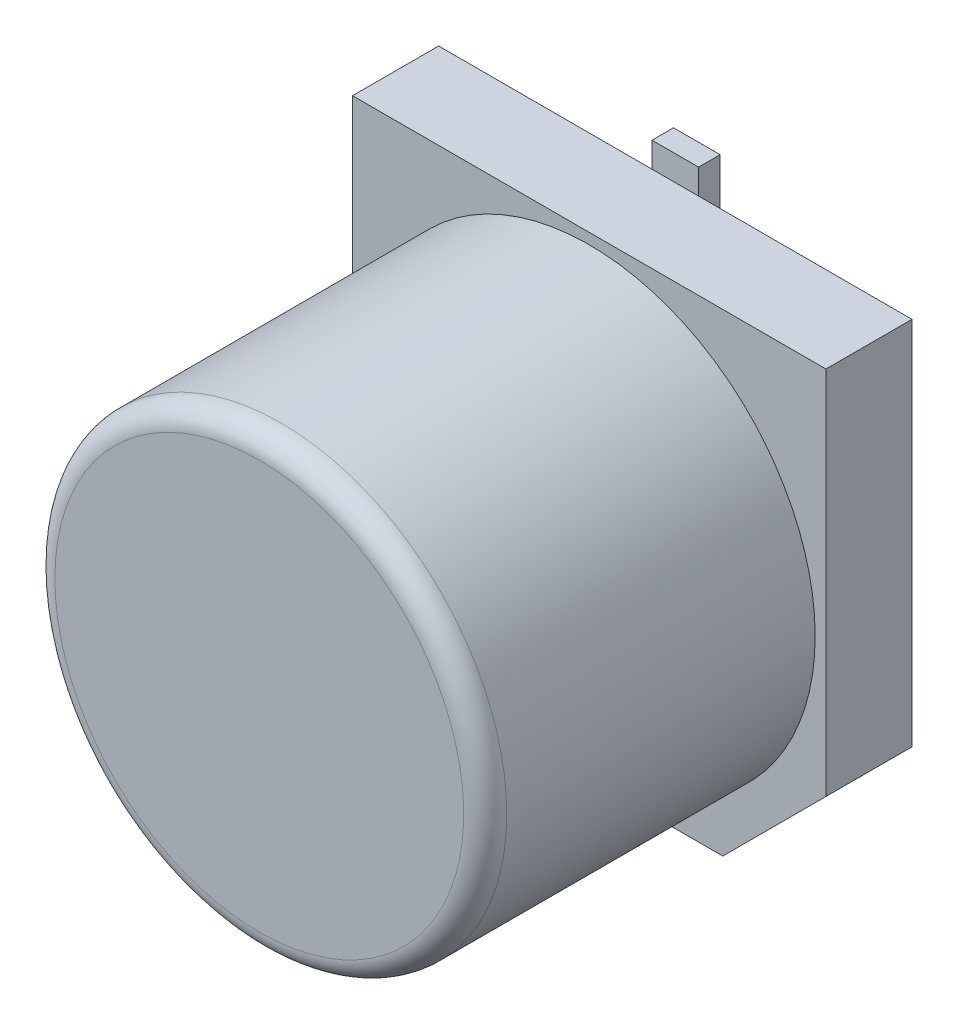
ISO-10303-21;
HEADER;
FILE_DESCRIPTION(('STEP AP214'),'2;1');
FILE_NAME('part.step','',(''),(''),'','','');
FILE_SCHEMA(('AUTOMOTIVE_DESIGN { 1 0 10303 214 1 1 1 1 }'));
ENDSEC;
DATA;
#1=APPLICATION_CONTEXT('core data for automotive mechanical design processes');
#2=APPLICATION_PROTOCOL_DEFINITION('international standard','automotive_design',2000,#1);
#3=PRODUCT_CONTEXT('',#1,'mechanical');
#4=PRODUCT('Part','Part','',(#3));
#5=PRODUCT_RELATED_PRODUCT_CATEGORY('part','',(#4));
#6=PRODUCT_DEFINITION_FORMATION('','',#4);
#7=PRODUCT_DEFINITION_CONTEXT('part definition',#1,'design');
#8=PRODUCT_DEFINITION('design','',#6,#7);
#9=PRODUCT_DEFINITION_SHAPE('','',#8);
#10=(LENGTH_UNIT() NAMED_UNIT(*) SI_UNIT(.MILLI.,.METRE.));
#11=(NAMED_UNIT(*) PLANE_ANGLE_UNIT() SI_UNIT($,.RADIAN.));
#12=(NAMED_UNIT(*) SI_UNIT($,.STERADIAN.) SOLID_ANGLE_UNIT());
#13=UNCERTAINTY_MEASURE_WITH_UNIT(LENGTH_MEASURE(1.E-05),#10,'distance_accuracy_value','');
#14=(GEOMETRIC_REPRESENTATION_CONTEXT(3) GLOBAL_UNCERTAINTY_ASSIGNED_CONTEXT((#13)) GLOBAL_UNIT_ASSIGNED_CONTEXT((#10,
#11,#12)) REPRESENTATION_CONTEXT('',''));
#15=CARTESIAN_POINT('',(0.,0.,0.));
#16=DIRECTION('',(0.,0.,1.));
#17=DIRECTION('',(1.,0.,0.));
#18=AXIS2_PLACEMENT_3D('',#15,#16,#17);
#19=CARTESIAN_POINT('',(0.,0.,0.));
#20=DIRECTION('',(0.,0.,1.));
#21=DIRECTION('',(1.,0.,0.));
#22=AXIS2_PLACEMENT_3D('',#19,#20,#21);
#23=PLANE('',#22);
#24=DIRECTION('',(1.,0.,0.));
#25=VECTOR('',#24,1.);
#26=CARTESIAN_POINT('',(0.325,-5.65,0.));
#27=LINE('',#26,#25);
#28=CARTESIAN_POINT('',(0.325,-5.65,0.));
#29=VERTEX_POINT('',#28);
#30=CARTESIAN_POINT('',(-0.325000000000001,-5.65,0.));
#31=VERTEX_POINT('',#30);
#32=EDGE_CURVE('E144',#29,#31,#27,.F.);
#33=ORIENTED_EDGE('',*,*,#32,.T.);
#34=DIRECTION('',(0.,1.,0.));
#35=VECTOR('',#34,1.);
#36=CARTESIAN_POINT('',(-0.325,-3.375,0.));
#37=LINE('',#36,#35);
#38=CARTESIAN_POINT('',(-0.325,-3.375,0.));
#39=VERTEX_POINT('',#38);
#40=EDGE_CURVE('E143',#31,#39,#37,.T.);
#41=ORIENTED_EDGE('',*,*,#40,.T.);
#42=CARTESIAN_POINT('',(0.,-3.375,0.));
#43=DIRECTION('',(0.,0.,1.));
#44=DIRECTION('',(1.,0.,0.));
#45=AXIS2_PLACEMENT_3D('',#42,#43,#44);
#46=CIRCLE('',#45,0.325);
#47=CARTESIAN_POINT('',(0.325,-3.375,0.));
#48=VERTEX_POINT('',#47);
#49=EDGE_CURVE('E21',#48,#39,#46,.T.);
#50=ORIENTED_EDGE('',*,*,#49,.F.);
#51=DIRECTION('',(0.,-1.,0.));
#52=VECTOR('',#51,1.);
#53=CARTESIAN_POINT('',(0.325,-3.375,0.));
#54=LINE('',#53,#52);
#55=EDGE_CURVE('E129',#48,#29,#54,.T.);
#56=ORIENTED_EDGE('',*,*,#55,.T.);
#57=EDGE_LOOP('',(#33,#41,#50,#56));
#58=FACE_BOUND('',#57,.T.);
#59=ADVANCED_FACE('F17',(#58),#23,.F.);
#60=CARTESIAN_POINT('',(0.,0.,0.));
#61=DIRECTION('',(0.,0.,1.));
#62=DIRECTION('',(1.,0.,0.));
#63=AXIS2_PLACEMENT_3D('',#60,#61,#62);
#64=PLANE('',#63);
#65=DIRECTION('',(1.,0.,0.));
#66=VECTOR('',#65,1.);
#67=CARTESIAN_POINT('',(0.325,1.35,0.));
#68=LINE('',#67,#66);
#69=CARTESIAN_POINT('',(-0.325,1.35,0.));
#70=VERTEX_POINT('',#69);
#71=CARTESIAN_POINT('',(0.325,1.35,0.));
#72=VERTEX_POINT('',#71);
#73=EDGE_CURVE('E219',#70,#72,#68,.T.);
#74=ORIENTED_EDGE('',*,*,#73,.T.);
#75=DIRECTION('',(0.,-1.,0.));
#76=VECTOR('',#75,1.);
#77=CARTESIAN_POINT('',(0.325,1.35,0.));
#78=LINE('',#77,#76);
#79=CARTESIAN_POINT('',(0.324999999999999,-0.925,0.));
#80=VERTEX_POINT('',#79);
#81=EDGE_CURVE('E202',#72,#80,#78,.T.);
#82=ORIENTED_EDGE('',*,*,#81,.T.);
#83=CARTESIAN_POINT('',(0.,-0.925,0.));
#84=DIRECTION('',(0.,0.,1.));
#85=DIRECTION('',(1.,0.,0.));
#86=AXIS2_PLACEMENT_3D('',#83,#84,#85);
#87=CIRCLE('',#86,0.325);
#88=CARTESIAN_POINT('',(-0.325,-0.925,0.));
#89=VERTEX_POINT('',#88);
#90=EDGE_CURVE('E248',#89,#80,#87,.T.);
#91=ORIENTED_EDGE('',*,*,#90,.F.);
#92=DIRECTION('',(0.,1.,0.));
#93=VECTOR('',#92,1.);
#94=CARTESIAN_POINT('',(-0.325,1.35,0.));
#95=LINE('',#94,#93);
#96=EDGE_CURVE('E212',#89,#70,#95,.T.);
#97=ORIENTED_EDGE('',*,*,#96,.T.);
#98=EDGE_LOOP('',(#74,#82,#91,#97));
#99=FACE_BOUND('',#98,.T.);
#100=ADVANCED_FACE('F286',(#99),#64,.F.);
#101=CARTESIAN_POINT('',(0.325,1.35,-2.680018656651));
#102=DIRECTION('',(0.,-1.,0.));
#103=DIRECTION('',(1.,0.,0.));
#104=AXIS2_PLACEMENT_3D('',#101,#102,#103);
#105=PLANE('',#104);
#106=DIRECTION('',(0.,0.,1.));
#107=VECTOR('',#106,1.);
#108=CARTESIAN_POINT('',(-0.325,1.35,-2.680018656651));
#109=LINE('',#108,#107);
#110=CARTESIAN_POINT('',(-0.325,1.35,0.3));
#111=VERTEX_POINT('',#110);
#112=EDGE_CURVE('E148',#70,#111,#109,.T.);
#113=ORIENTED_EDGE('',*,*,#112,.T.);
#114=DIRECTION('',(-1.,0.,0.));
#115=VECTOR('',#114,1.);
#116=CARTESIAN_POINT('',(0.,1.35,0.3));
#117=LINE('',#116,#115);
#118=CARTESIAN_POINT('',(0.325,1.35,0.3));
#119=VERTEX_POINT('',#118);
#120=EDGE_CURVE('E206',#111,#119,#117,.F.);
#121=ORIENTED_EDGE('',*,*,#120,.T.);
#122=DIRECTION('',(0.,0.,1.));
#123=VECTOR('',#122,1.);
#124=CARTESIAN_POINT('',(0.325,1.35,-2.680018656651));
#125=LINE('',#124,#123);
#126=EDGE_CURVE('E199',#119,#72,#125,.F.);
#127=ORIENTED_EDGE('',*,*,#126,.T.);
#128=ORIENTED_EDGE('',*,*,#73,.F.);
#129=EDGE_LOOP('',(#113,#121,#127,#128));
#130=FACE_BOUND('',#129,.T.);
#131=ADVANCED_FACE('F279',(#130),#105,.F.);
#132=CARTESIAN_POINT('',(0.325,-5.65,-2.680018656651));
#133=DIRECTION('',(0.,1.,0.));
#134=DIRECTION('',(0.,0.,1.));
#135=AXIS2_PLACEMENT_3D('',#132,#133,#134);
#136=PLANE('',#135);
#137=DIRECTION('',(0.,0.,1.));
#138=VECTOR('',#137,1.);
#139=CARTESIAN_POINT('',(0.325,-5.65,-2.680018656651));
#140=LINE('',#139,#138);
#141=CARTESIAN_POINT('',(0.325,-5.65,0.3));
#142=VERTEX_POINT('',#141);
#143=EDGE_CURVE('E195',#29,#142,#140,.T.);
#144=ORIENTED_EDGE('',*,*,#143,.T.);
#145=DIRECTION('',(-1.,0.,0.));
#146=VECTOR('',#145,1.);
#147=CARTESIAN_POINT('',(0.,-5.65,0.3));
#148=LINE('',#147,#146);
#149=CARTESIAN_POINT('',(-0.325000000000001,-5.65,0.3));
#150=VERTEX_POINT('',#149);
#151=EDGE_CURVE('E171',#142,#150,#148,.T.);
#152=ORIENTED_EDGE('',*,*,#151,.T.);
#153=DIRECTION('',(0.,0.,1.));
#154=VECTOR('',#153,1.);
#155=CARTESIAN_POINT('',(-0.325000000000001,-5.65,-2.680018656651));
#156=LINE('',#155,#154);
#157=EDGE_CURVE('E149',#150,#31,#156,.F.);
#158=ORIENTED_EDGE('',*,*,#157,.T.);
#159=ORIENTED_EDGE('',*,*,#32,.F.);
#160=EDGE_LOOP('',(#144,#152,#158,#159));
#161=FACE_BOUND('',#160,.T.);
#162=ADVANCED_FACE('F436',(#161),#136,.F.);
#163=CARTESIAN_POINT('',(0.325,-3.375,-2.680018656651));
#164=DIRECTION('',(-1.,0.,0.));
#165=DIRECTION('',(0.,-1.,0.));
#166=AXIS2_PLACEMENT_3D('',#163,#164,#165);
#167=PLANE('',#166);
#168=DIRECTION('',(0.,0.,1.));
#169=VECTOR('',#168,1.);
#170=CARTESIAN_POINT('',(0.325,-3.375,-2.680018656651));
#171=LINE('',#170,#169);
#172=CARTESIAN_POINT('',(0.325,-3.375,0.3));
#173=VERTEX_POINT('',#172);
#174=EDGE_CURVE('E140',#173,#48,#171,.F.);
#175=ORIENTED_EDGE('',*,*,#174,.F.);
#176=DIRECTION('',(0.,1.,0.));
#177=VECTOR('',#176,1.);
#178=CARTESIAN_POINT('',(0.325,0.,0.3));
#179=LINE('',#178,#177);
#180=CARTESIAN_POINT('',(0.325,-5.6,0.3));
#181=VERTEX_POINT('',#180);
#182=EDGE_CURVE('E170',#181,#173,#179,.T.);
#183=ORIENTED_EDGE('',*,*,#182,.F.);
#184=DIRECTION('',(0.,1.,0.));
#185=VECTOR('',#184,1.);
#186=CARTESIAN_POINT('',(0.325,-3.375,0.3));
#187=LINE('',#186,#185);
#188=EDGE_CURVE('E184',#181,#142,#187,.F.);
#189=ORIENTED_EDGE('',*,*,#188,.T.);
#190=ORIENTED_EDGE('',*,*,#143,.F.);
#191=ORIENTED_EDGE('',*,*,#55,.F.);
#192=EDGE_LOOP('',(#175,#183,#189,#190,#191));
#193=FACE_BOUND('',#192,.T.);
#194=ADVANCED_FACE('F443',(#193),#167,.F.);
#195=CARTESIAN_POINT('',(0.,-3.375,-2.680018656651));
#196=DIRECTION('',(0.,0.,1.));
#197=DIRECTION('',(1.,0.,0.));
#198=AXIS2_PLACEMENT_3D('',#195,#196,#197);
#199=CYLINDRICAL_SURFACE('',#198,0.325);
#200=ORIENTED_EDGE('',*,*,#174,.T.);
#201=ORIENTED_EDGE('',*,*,#49,.T.);
#202=DIRECTION('',(0.,0.,1.));
#203=VECTOR('',#202,1.);
#204=CARTESIAN_POINT('',(-0.325,-3.375,-2.680018656651));
#205=LINE('',#204,#203);
#206=CARTESIAN_POINT('',(-0.325,-3.375,0.3));
#207=VERTEX_POINT('',#206);
#208=EDGE_CURVE('E138',#39,#207,#205,.T.);
#209=ORIENTED_EDGE('',*,*,#208,.T.);
#210=CARTESIAN_POINT('',(0.,-3.375,0.3));
#211=DIRECTION('',(0.,0.,1.));
#212=DIRECTION('',(1.,0.,0.));
#213=AXIS2_PLACEMENT_3D('',#210,#211,#212);
#214=CIRCLE('',#213,0.325);
#215=EDGE_CURVE('E247',#173,#207,#214,.T.);
#216=ORIENTED_EDGE('',*,*,#215,.F.);
#217=EDGE_LOOP('',(#200,#201,#209,#216));
#218=FACE_BOUND('',#217,.T.);
#219=ADVANCED_FACE('F135',(#218),#199,.T.);
#220=CARTESIAN_POINT('',(-0.325,-3.375,-2.680018656651));
#221=DIRECTION('',(1.,0.,0.));
#222=DIRECTION('',(0.,1.,0.));
#223=AXIS2_PLACEMENT_3D('',#220,#221,#222);
#224=PLANE('',#223);
#225=ORIENTED_EDGE('',*,*,#157,.F.);
#226=DIRECTION('',(0.,1.,0.));
#227=VECTOR('',#226,1.);
#228=CARTESIAN_POINT('',(-0.325,-3.375,0.3));
#229=LINE('',#228,#227);
#230=CARTESIAN_POINT('',(-0.325,-5.6,0.3));
#231=VERTEX_POINT('',#230);
#232=EDGE_CURVE('E168',#150,#231,#229,.T.);
#233=ORIENTED_EDGE('',*,*,#232,.T.);
#234=DIRECTION('',(0.,1.,0.));
#235=VECTOR('',#234,1.);
#236=CARTESIAN_POINT('',(-0.325,0.,0.3));
#237=LINE('',#236,#235);
#238=EDGE_CURVE('E153',#207,#231,#237,.F.);
#239=ORIENTED_EDGE('',*,*,#238,.F.);
#240=ORIENTED_EDGE('',*,*,#208,.F.);
#241=ORIENTED_EDGE('',*,*,#40,.F.);
#242=EDGE_LOOP('',(#225,#233,#239,#240,#241));
#243=FACE_BOUND('',#242,.T.);
#244=ADVANCED_FACE('F151',(#243),#224,.F.);
#245=CARTESIAN_POINT('',(-0.325,1.35,-2.680018656651));
#246=DIRECTION('',(1.,0.,0.));
#247=DIRECTION('',(0.,1.,0.));
#248=AXIS2_PLACEMENT_3D('',#245,#246,#247);
#249=PLANE('',#248);
#250=DIRECTION('',(0.,0.,1.));
#251=VECTOR('',#250,1.);
#252=CARTESIAN_POINT('',(-0.325000000000001,-0.925,-2.680018656651));
#253=LINE('',#252,#251);
#254=CARTESIAN_POINT('',(-0.325,-0.925,0.3));
#255=VERTEX_POINT('',#254);
#256=EDGE_CURVE('E225',#255,#89,#253,.F.);
#257=ORIENTED_EDGE('',*,*,#256,.F.);
#258=DIRECTION('',(0.,1.,0.));
#259=VECTOR('',#258,1.);
#260=CARTESIAN_POINT('',(-0.325,0.,0.3));
#261=LINE('',#260,#259);
#262=CARTESIAN_POINT('',(-0.325,1.,0.3));
#263=VERTEX_POINT('',#262);
#264=EDGE_CURVE('E246',#263,#255,#261,.F.);
#265=ORIENTED_EDGE('',*,*,#264,.F.);
#266=DIRECTION('',(0.,1.,0.));
#267=VECTOR('',#266,1.);
#268=CARTESIAN_POINT('',(-0.325,-0.925,0.3));
#269=LINE('',#268,#267);
#270=EDGE_CURVE('E208',#263,#111,#269,.T.);
#271=ORIENTED_EDGE('',*,*,#270,.T.);
#272=ORIENTED_EDGE('',*,*,#112,.F.);
#273=ORIENTED_EDGE('',*,*,#96,.F.);
#274=EDGE_LOOP('',(#257,#265,#271,#272,#273));
#275=FACE_BOUND('',#274,.T.);
#276=ADVANCED_FACE('F270',(#275),#249,.F.);
#277=CARTESIAN_POINT('',(0.,-0.925,-2.680018656651));
#278=DIRECTION('',(0.,0.,1.));
#279=DIRECTION('',(1.,0.,0.));
#280=AXIS2_PLACEMENT_3D('',#277,#278,#279);
#281=CYLINDRICAL_SURFACE('',#280,0.325);
#282=ORIENTED_EDGE('',*,*,#256,.T.);
#283=ORIENTED_EDGE('',*,*,#90,.T.);
#284=DIRECTION('',(0.,0.,1.));
#285=VECTOR('',#284,1.);
#286=CARTESIAN_POINT('',(0.324999999999999,-0.925,-2.680018656651));
#287=LINE('',#286,#285);
#288=CARTESIAN_POINT('',(0.325,-0.925,0.3));
#289=VERTEX_POINT('',#288);
#290=EDGE_CURVE('E203',#80,#289,#287,.T.);
#291=ORIENTED_EDGE('',*,*,#290,.T.);
#292=CARTESIAN_POINT('',(0.,-0.925,0.3));
#293=DIRECTION('',(0.,0.,1.));
#294=DIRECTION('',(1.,0.,0.));
#295=AXIS2_PLACEMENT_3D('',#292,#293,#294);
#296=CIRCLE('',#295,0.325);
#297=EDGE_CURVE('E242',#255,#289,#296,.T.);
#298=ORIENTED_EDGE('',*,*,#297,.F.);
#299=EDGE_LOOP('',(#282,#283,#291,#298));
#300=FACE_BOUND('',#299,.T.);
#301=ADVANCED_FACE('F287',(#300),#281,.T.);
#302=CARTESIAN_POINT('',(0.325,1.35,-2.680018656651));
#303=DIRECTION('',(-1.,0.,0.));
#304=DIRECTION('',(0.,-1.,0.));
#305=AXIS2_PLACEMENT_3D('',#302,#303,#304);
#306=PLANE('',#305);
#307=ORIENTED_EDGE('',*,*,#126,.F.);
#308=DIRECTION('',(0.,1.,0.));
#309=VECTOR('',#308,1.);
#310=CARTESIAN_POINT('',(0.325,-0.925,0.3));
#311=LINE('',#310,#309);
#312=CARTESIAN_POINT('',(0.325,1.,0.3));
#313=VERTEX_POINT('',#312);
#314=EDGE_CURVE('E187',#119,#313,#311,.F.);
#315=ORIENTED_EDGE('',*,*,#314,.T.);
#316=DIRECTION('',(0.,1.,0.));
#317=VECTOR('',#316,1.);
#318=CARTESIAN_POINT('',(0.325,0.,0.3));
#319=LINE('',#318,#317);
#320=EDGE_CURVE('E245',#289,#313,#319,.T.);
#321=ORIENTED_EDGE('',*,*,#320,.F.);
#322=ORIENTED_EDGE('',*,*,#290,.F.);
#323=ORIENTED_EDGE('',*,*,#81,.F.);
#324=EDGE_LOOP('',(#307,#315,#321,#322,#323));
#325=FACE_BOUND('',#324,.T.);
#326=ADVANCED_FACE('F282',(#325),#306,.F.);
#327=CARTESIAN_POINT('',(0.,-0.925,0.3));
#328=DIRECTION('',(0.,0.,-1.));
#329=DIRECTION('',(-1.,0.,0.));
#330=AXIS2_PLACEMENT_3D('',#327,#328,#329);
#331=PLANE('',#330);
#332=ORIENTED_EDGE('',*,*,#120,.F.);
#333=ORIENTED_EDGE('',*,*,#270,.F.);
#334=DIRECTION('',(1.,0.,0.));
#335=VECTOR('',#334,1.);
#336=CARTESIAN_POINT('',(-3.3,1.,0.3));
#337=LINE('',#336,#335);
#338=EDGE_CURVE('E262',#263,#313,#337,.T.);
#339=ORIENTED_EDGE('',*,*,#338,.T.);
#340=ORIENTED_EDGE('',*,*,#314,.F.);
#341=EDGE_LOOP('',(#332,#333,#339,#340));
#342=FACE_BOUND('',#341,.T.);
#343=ADVANCED_FACE('F276',(#342),#331,.F.);
#344=CARTESIAN_POINT('',(0.,-3.375,0.3));
#345=DIRECTION('',(0.,0.,-1.));
#346=DIRECTION('',(-1.,0.,0.));
#347=AXIS2_PLACEMENT_3D('',#344,#345,#346);
#348=PLANE('',#347);
#349=ORIENTED_EDGE('',*,*,#232,.F.);
#350=ORIENTED_EDGE('',*,*,#151,.F.);
#351=ORIENTED_EDGE('',*,*,#188,.F.);
#352=DIRECTION('',(1.,0.,0.));
#353=VECTOR('',#352,1.);
#354=CARTESIAN_POINT('',(3.3,-5.6,0.3));
#355=LINE('',#354,#353);
#356=EDGE_CURVE('E161',#181,#231,#355,.F.);
#357=ORIENTED_EDGE('',*,*,#356,.T.);
#358=EDGE_LOOP('',(#349,#350,#351,#357));
#359=FACE_BOUND('',#358,.T.);
#360=ADVANCED_FACE('F368',(#359),#348,.F.);
#361=CARTESIAN_POINT('',(0.,0.,0.3));
#362=DIRECTION('',(0.,0.,-1.));
#363=DIRECTION('',(-1.,0.,0.));
#364=AXIS2_PLACEMENT_3D('',#361,#362,#363);
#365=PLANE('',#364);
#366=ORIENTED_EDGE('',*,*,#320,.T.);
#367=DIRECTION('',(1.,0.,0.));
#368=VECTOR('',#367,1.);
#369=CARTESIAN_POINT('',(-3.3,1.,0.3));
#370=LINE('',#369,#368);
#371=CARTESIAN_POINT('',(3.3,1.,0.3));
#372=VERTEX_POINT('',#371);
#373=EDGE_CURVE('E307',#313,#372,#370,.T.);
#374=ORIENTED_EDGE('',*,*,#373,.T.);
#375=DIRECTION('',(0.,1.,0.));
#376=VECTOR('',#375,1.);
#377=CARTESIAN_POINT('',(3.3,1.,0.3));
#378=LINE('',#377,#376);
#379=CARTESIAN_POINT('',(3.3,-4.161879502662,0.3));
#380=VERTEX_POINT('',#379);
#381=EDGE_CURVE('E315',#372,#380,#378,.F.);
#382=ORIENTED_EDGE('',*,*,#381,.T.);
#383=DIRECTION('',(-0.707106781186548,-0.707106781186548,0.));
#384=VECTOR('',#383,1.);
#385=CARTESIAN_POINT('',(1.861879502662,-5.6,0.3));
#386=LINE('',#385,#384);
#387=CARTESIAN_POINT('',(1.861879502662,-5.6,0.3));
#388=VERTEX_POINT('',#387);
#389=EDGE_CURVE('E354',#380,#388,#386,.T.);
#390=ORIENTED_EDGE('',*,*,#389,.T.);
#391=DIRECTION('',(1.,0.,0.));
#392=VECTOR('',#391,1.);
#393=CARTESIAN_POINT('',(3.3,-5.6,0.3));
#394=LINE('',#393,#392);
#395=EDGE_CURVE('E165',#388,#181,#394,.F.);
#396=ORIENTED_EDGE('',*,*,#395,.T.);
#397=ORIENTED_EDGE('',*,*,#182,.T.);
#398=ORIENTED_EDGE('',*,*,#215,.T.);
#399=ORIENTED_EDGE('',*,*,#238,.T.);
#400=DIRECTION('',(1.,0.,0.));
#401=VECTOR('',#400,1.);
#402=CARTESIAN_POINT('',(3.3,-5.6,0.3));
#403=LINE('',#402,#401);
#404=CARTESIAN_POINT('',(-1.861879502662,-5.6,0.3));
#405=VERTEX_POINT('',#404);
#406=EDGE_CURVE('E164',#231,#405,#403,.F.);
#407=ORIENTED_EDGE('',*,*,#406,.T.);
#408=DIRECTION('',(-0.707106781186548,0.707106781186548,0.));
#409=VECTOR('',#408,1.);
#410=CARTESIAN_POINT('',(-3.3,-4.161879502662,0.3));
#411=LINE('',#410,#409);
#412=CARTESIAN_POINT('',(-3.3,-4.161879502662,0.3));
#413=VERTEX_POINT('',#412);
#414=EDGE_CURVE('E349',#405,#413,#411,.T.);
#415=ORIENTED_EDGE('',*,*,#414,.T.);
#416=DIRECTION('',(0.,1.,0.));
#417=VECTOR('',#416,1.);
#418=CARTESIAN_POINT('',(-3.3,-5.6,0.3));
#419=LINE('',#418,#417);
#420=CARTESIAN_POINT('',(-3.3,1.,0.3));
#421=VERTEX_POINT('',#420);
#422=EDGE_CURVE('E326',#413,#421,#419,.T.);
#423=ORIENTED_EDGE('',*,*,#422,.T.);
#424=DIRECTION('',(1.,0.,0.));
#425=VECTOR('',#424,1.);
#426=CARTESIAN_POINT('',(-3.3,1.,0.3));
#427=LINE('',#426,#425);
#428=EDGE_CURVE('E259',#421,#263,#427,.T.);
#429=ORIENTED_EDGE('',*,*,#428,.T.);
#430=ORIENTED_EDGE('',*,*,#264,.T.);
#431=ORIENTED_EDGE('',*,*,#297,.T.);
#432=EDGE_LOOP('',(#366,#374,#382,#390,#396,#397,#398,#399,#407,#415,#423,#429,#430,#431));
#433=FACE_BOUND('',#432,.T.);
#434=ADVANCED_FACE('F290',(#433),#365,.T.);
#435=CARTESIAN_POINT('',(-3.3,-5.6,6.1));
#436=DIRECTION('',(1.,0.,0.));
#437=DIRECTION('',(0.,0.,-1.));
#438=AXIS2_PLACEMENT_3D('',#435,#436,#437);
#439=PLANE('',#438);
#440=DIRECTION('',(0.,1.,0.));
#441=VECTOR('',#440,1.);
#442=CARTESIAN_POINT('',(-3.3,0.,1.5));
#443=LINE('',#442,#441);
#444=CARTESIAN_POINT('',(-3.3,-4.161879502662,1.5));
#445=VERTEX_POINT('',#444);
#446=CARTESIAN_POINT('',(-3.3,1.,1.5));
#447=VERTEX_POINT('',#446);
#448=EDGE_CURVE('E338',#445,#447,#443,.T.);
#449=ORIENTED_EDGE('',*,*,#448,.T.);
#450=DIRECTION('',(0.,0.,-1.));
#451=VECTOR('',#450,1.);
#452=CARTESIAN_POINT('',(-3.3,1.,6.1));
#453=LINE('',#452,#451);
#454=EDGE_CURVE('E263',#447,#421,#453,.T.);
#455=ORIENTED_EDGE('',*,*,#454,.T.);
#456=ORIENTED_EDGE('',*,*,#422,.F.);
#457=DIRECTION('',(0.,0.,1.));
#458=VECTOR('',#457,1.);
#459=CARTESIAN_POINT('',(-3.3,-4.161879502662,0.3));
#460=LINE('',#459,#458);
#461=EDGE_CURVE('E344',#413,#445,#460,.T.);
#462=ORIENTED_EDGE('',*,*,#461,.T.);
#463=EDGE_LOOP('',(#449,#455,#456,#462));
#464=FACE_BOUND('',#463,.T.);
#465=ADVANCED_FACE('F374',(#464),#439,.F.);
#466=CARTESIAN_POINT('',(-3.3,1.,6.1));
#467=DIRECTION('',(0.,-1.,0.));
#468=DIRECTION('',(0.,0.,-1.));
#469=AXIS2_PLACEMENT_3D('',#466,#467,#468);
#470=PLANE('',#469);
#471=DIRECTION('',(0.,0.,1.));
#472=VECTOR('',#471,1.);
#473=CARTESIAN_POINT('',(3.3,1.,6.1));
#474=LINE('',#473,#472);
#475=CARTESIAN_POINT('',(3.3,1.,1.5));
#476=VERTEX_POINT('',#475);
#477=EDGE_CURVE('E312',#476,#372,#474,.F.);
#478=ORIENTED_EDGE('',*,*,#477,.T.);
#479=ORIENTED_EDGE('',*,*,#373,.F.);
#480=ORIENTED_EDGE('',*,*,#338,.F.);
#481=ORIENTED_EDGE('',*,*,#428,.F.);
#482=ORIENTED_EDGE('',*,*,#454,.F.);
#483=DIRECTION('',(-1.,0.,0.));
#484=VECTOR('',#483,1.);
#485=CARTESIAN_POINT('',(0.,1.,1.5));
#486=LINE('',#485,#484);
#487=EDGE_CURVE('E330',#447,#476,#486,.F.);
#488=ORIENTED_EDGE('',*,*,#487,.T.);
#489=EDGE_LOOP('',(#478,#479,#480,#481,#482,#488));
#490=FACE_BOUND('',#489,.T.);
#491=ADVANCED_FACE('F327',(#490),#470,.F.);
#492=CARTESIAN_POINT('',(3.3,1.,6.1));
#493=DIRECTION('',(-1.,0.,0.));
#494=DIRECTION('',(0.,0.,1.));
#495=AXIS2_PLACEMENT_3D('',#492,#493,#494);
#496=PLANE('',#495);
#497=ORIENTED_EDGE('',*,*,#381,.F.);
#498=ORIENTED_EDGE('',*,*,#477,.F.);
#499=DIRECTION('',(0.,1.,0.));
#500=VECTOR('',#499,1.);
#501=CARTESIAN_POINT('',(3.3,0.,1.5));
#502=LINE('',#501,#500);
#503=CARTESIAN_POINT('',(3.3,-4.161879502662,1.5));
#504=VERTEX_POINT('',#503);
#505=EDGE_CURVE('E340',#476,#504,#502,.F.);
#506=ORIENTED_EDGE('',*,*,#505,.T.);
#507=DIRECTION('',(0.,0.,1.));
#508=VECTOR('',#507,1.);
#509=CARTESIAN_POINT('',(3.3,-4.161879502662,0.3));
#510=LINE('',#509,#508);
#511=EDGE_CURVE('E320',#504,#380,#510,.F.);
#512=ORIENTED_EDGE('',*,*,#511,.T.);
#513=EDGE_LOOP('',(#497,#498,#506,#512));
#514=FACE_BOUND('',#513,.T.);
#515=ADVANCED_FACE('F359',(#514),#496,.F.);
#516=CARTESIAN_POINT('',(1.861879502662,-5.6,0.3));
#517=DIRECTION('',(-0.707106781186548,0.707106781186548,0.));
#518=DIRECTION('',(-0.707106781186548,-0.707106781186548,0.));
#519=AXIS2_PLACEMENT_3D('',#516,#517,#518);
#520=PLANE('',#519);
#521=ORIENTED_EDGE('',*,*,#389,.F.);
#522=ORIENTED_EDGE('',*,*,#511,.F.);
#523=DIRECTION('',(-0.707106781186547,-0.707106781186548,0.));
#524=VECTOR('',#523,1.);
#525=CARTESIAN_POINT('',(3.3,-4.161879502662,1.5));
#526=LINE('',#525,#524);
#527=CARTESIAN_POINT('',(1.861879502662,-5.6,1.5));
#528=VERTEX_POINT('',#527);
#529=EDGE_CURVE('E342',#504,#528,#526,.T.);
#530=ORIENTED_EDGE('',*,*,#529,.T.);
#531=DIRECTION('',(0.,0.,1.));
#532=VECTOR('',#531,1.);
#533=CARTESIAN_POINT('',(1.861879502662,-5.6,6.1));
#534=LINE('',#533,#532);
#535=EDGE_CURVE('E181',#528,#388,#534,.F.);
#536=ORIENTED_EDGE('',*,*,#535,.T.);
#537=EDGE_LOOP('',(#521,#522,#530,#536));
#538=FACE_BOUND('',#537,.T.);
#539=ADVANCED_FACE('F361',(#538),#520,.F.);
#540=CARTESIAN_POINT('',(3.3,-5.6,6.1));
#541=DIRECTION('',(0.,1.,0.));
#542=DIRECTION('',(0.,0.,1.));
#543=AXIS2_PLACEMENT_3D('',#540,#541,#542);
#544=PLANE('',#543);
#545=ORIENTED_EDGE('',*,*,#406,.F.);
#546=ORIENTED_EDGE('',*,*,#356,.F.);
#547=ORIENTED_EDGE('',*,*,#395,.F.);
#548=ORIENTED_EDGE('',*,*,#535,.F.);
#549=DIRECTION('',(-1.,0.,0.));
#550=VECTOR('',#549,1.);
#551=CARTESIAN_POINT('',(0.,-5.6,1.5));
#552=LINE('',#551,#550);
#553=CARTESIAN_POINT('',(-1.861879502662,-5.6,1.5));
#554=VERTEX_POINT('',#553);
#555=EDGE_CURVE('E36',#528,#554,#552,.T.);
#556=ORIENTED_EDGE('',*,*,#555,.T.);
#557=DIRECTION('',(0.,0.,1.));
#558=VECTOR('',#557,1.);
#559=CARTESIAN_POINT('',(-1.861879502662,-5.6,0.3));
#560=LINE('',#559,#558);
#561=EDGE_CURVE('E175',#554,#405,#560,.F.);
#562=ORIENTED_EDGE('',*,*,#561,.T.);
#563=EDGE_LOOP('',(#545,#546,#547,#548,#556,#562));
#564=FACE_BOUND('',#563,.T.);
#565=ADVANCED_FACE('F370',(#564),#544,.F.);
#566=CARTESIAN_POINT('',(-3.3,-4.161879502662,0.3));
#567=DIRECTION('',(0.707106781186548,0.707106781186548,0.));
#568=DIRECTION('',(-0.707106781186548,0.707106781186548,0.));
#569=AXIS2_PLACEMENT_3D('',#566,#567,#568);
#570=PLANE('',#569);
#571=ORIENTED_EDGE('',*,*,#414,.F.);
#572=ORIENTED_EDGE('',*,*,#561,.F.);
#573=DIRECTION('',(-0.707106781186548,0.707106781186548,0.));
#574=VECTOR('',#573,1.);
#575=CARTESIAN_POINT('',(-1.861879502662,-5.6,1.5));
#576=LINE('',#575,#574);
#577=EDGE_CURVE('E241',#554,#445,#576,.T.);
#578=ORIENTED_EDGE('',*,*,#577,.T.);
#579=ORIENTED_EDGE('',*,*,#461,.F.);
#580=EDGE_LOOP('',(#571,#572,#578,#579));
#581=FACE_BOUND('',#580,.T.);
#582=ADVANCED_FACE('F376',(#581),#570,.F.);
#583=CARTESIAN_POINT('',(0.,0.,6.1));
#584=DIRECTION('',(0.,0.,-1.));
#585=DIRECTION('',(-1.,0.,0.));
#586=AXIS2_PLACEMENT_3D('',#583,#584,#585);
#587=PLANE('',#586);
#588=CARTESIAN_POINT('',(0.,-2.3,6.1));
#589=DIRECTION('',(0.,0.,-1.));
#590=DIRECTION('',(-1.,0.,0.));
#591=AXIS2_PLACEMENT_3D('',#588,#589,#590);
#592=CIRCLE('',#591,2.84999999999996);
#593=CARTESIAN_POINT('',(-2.84999999999996,-2.3,6.1));
#594=VERTEX_POINT('',#593);
#595=EDGE_CURVE('E238',#594,#594,#592,.T.);
#596=ORIENTED_EDGE('',*,*,#595,.F.);
#597=EDGE_LOOP('',(#596));
#598=FACE_BOUND('',#597,.T.);
#599=ADVANCED_FACE('F380',(#598),#587,.F.);
#600=CARTESIAN_POINT('',(0.,0.,1.5));
#601=DIRECTION('',(0.,0.,-1.));
#602=DIRECTION('',(-1.,0.,0.));
#603=AXIS2_PLACEMENT_3D('',#600,#601,#602);
#604=PLANE('',#603);
#605=CARTESIAN_POINT('',(0.,-2.3,1.5));
#606=DIRECTION('',(0.,0.,1.));
#607=DIRECTION('',(1.,0.,0.));
#608=AXIS2_PLACEMENT_3D('',#605,#606,#607);
#609=CIRCLE('',#608,3.15);
#610=CARTESIAN_POINT('',(3.15,-2.3,1.5));
#611=VERTEX_POINT('',#610);
#612=EDGE_CURVE('E27',#611,#611,#609,.T.);
#613=ORIENTED_EDGE('',*,*,#612,.F.);
#614=EDGE_LOOP('',(#613));
#615=FACE_BOUND('',#614,.T.);
#616=ORIENTED_EDGE('',*,*,#555,.F.);
#617=ORIENTED_EDGE('',*,*,#529,.F.);
#618=ORIENTED_EDGE('',*,*,#505,.F.);
#619=ORIENTED_EDGE('',*,*,#487,.F.);
#620=ORIENTED_EDGE('',*,*,#448,.F.);
#621=ORIENTED_EDGE('',*,*,#577,.F.);
#622=EDGE_LOOP('',(#616,#617,#618,#619,#620,#621));
#623=FACE_BOUND('',#622,.T.);
#624=ADVANCED_FACE('F336',(#615,#623),#604,.F.);
#625=CARTESIAN_POINT('',(0.,-2.3,5.8));
#626=DIRECTION('',(0.,0.,-1.));
#627=DIRECTION('',(-1.,0.,0.));
#628=AXIS2_PLACEMENT_3D('',#625,#626,#627);
#629=TOROIDAL_SURFACE('',#628,2.85,0.299999999999999);
#630=CARTESIAN_POINT('',(0.,-2.3,5.8));
#631=DIRECTION('',(0.,0.,1.));
#632=DIRECTION('',(1.,0.,0.));
#633=AXIS2_PLACEMENT_3D('',#630,#631,#632);
#634=CIRCLE('',#633,3.15);
#635=CARTESIAN_POINT('',(3.15,-2.3,5.8));
#636=VERTEX_POINT('',#635);
#637=EDGE_CURVE('E11',#636,#636,#634,.F.);
#638=ORIENTED_EDGE('',*,*,#637,.F.);
#639=EDGE_LOOP('',(#638));
#640=FACE_BOUND('',#639,.T.);
#641=ORIENTED_EDGE('',*,*,#595,.T.);
#642=EDGE_LOOP('',(#641));
#643=FACE_BOUND('',#642,.T.);
#644=ADVANCED_FACE('F19',(#640,#643),#629,.T.);
#645=CARTESIAN_POINT('',(0.,-2.3,-9.1752308679));
#646=DIRECTION('',(0.,0.,1.));
#647=DIRECTION('',(1.,0.,0.));
#648=AXIS2_PLACEMENT_3D('',#645,#646,#647);
#649=CYLINDRICAL_SURFACE('',#648,3.15);
#650=ORIENTED_EDGE('',*,*,#637,.T.);
#651=EDGE_LOOP('',(#650));
#652=FACE_BOUND('',#651,.T.);
#653=ORIENTED_EDGE('',*,*,#612,.T.);
#654=EDGE_LOOP('',(#653));
#655=FACE_BOUND('',#654,.T.);
#656=ADVANCED_FACE('F390',(#652,#655),#649,.T.);
#657=CLOSED_SHELL('',(#59,#100,#131,#162,#194,#219,#244,#276,#301,#326,#343,#360,#434,#465,#491,
#515,#539,#565,#582,#599,#624,#644,#656));
#658=MANIFOLD_SOLID_BREP('B1',#657);
#659=ADVANCED_BREP_SHAPE_REPRESENTATION('',(#18,#658),#14);
#660=SHAPE_DEFINITION_REPRESENTATION(#9,#659);
ENDSEC;
END-ISO-10303-21;
